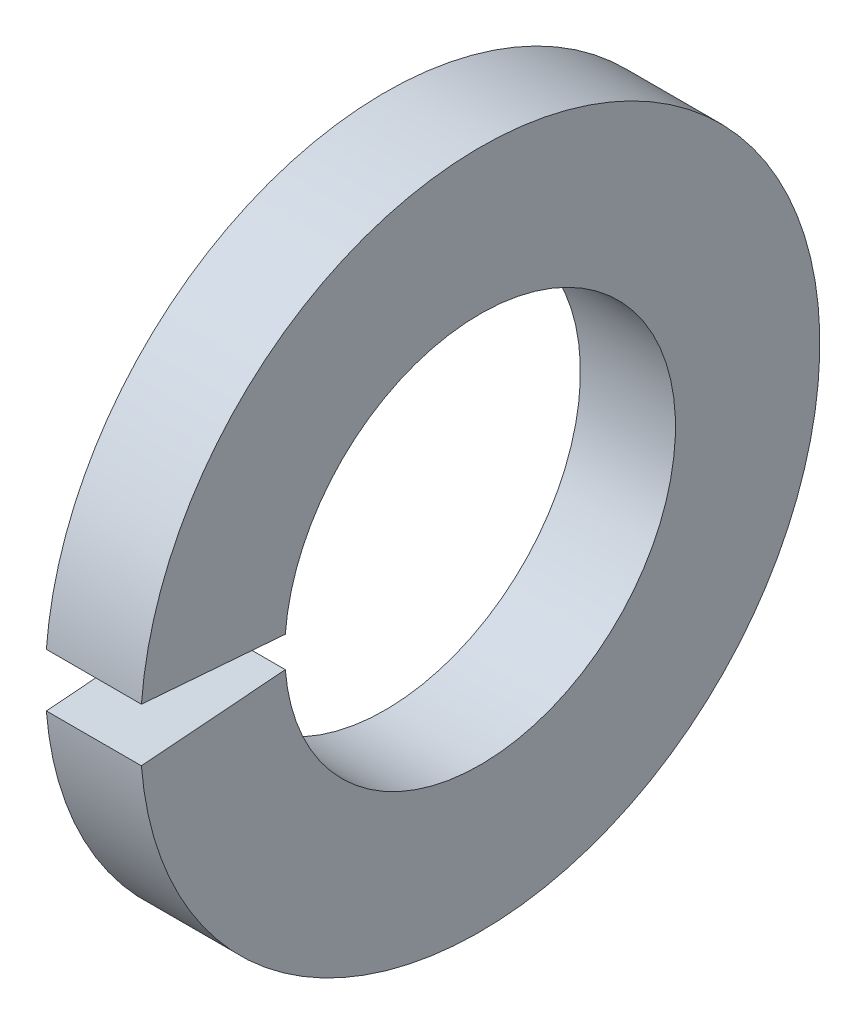
ISO-10303-21;
HEADER;
FILE_DESCRIPTION(('STEP AP214'),'2;1');
FILE_NAME('part.step','',(''),(''),'','','');
FILE_SCHEMA(('AUTOMOTIVE_DESIGN { 1 0 10303 214 1 1 1 1 }'));
ENDSEC;
DATA;
#1=APPLICATION_CONTEXT('core data for automotive mechanical design processes');
#2=APPLICATION_PROTOCOL_DEFINITION('international standard','automotive_design',2000,#1);
#3=PRODUCT_CONTEXT('',#1,'mechanical');
#4=PRODUCT('Part','Part','',(#3));
#5=PRODUCT_RELATED_PRODUCT_CATEGORY('part','',(#4));
#6=PRODUCT_DEFINITION_FORMATION('','',#4);
#7=PRODUCT_DEFINITION_CONTEXT('part definition',#1,'design');
#8=PRODUCT_DEFINITION('design','',#6,#7);
#9=PRODUCT_DEFINITION_SHAPE('','',#8);
#10=(LENGTH_UNIT() NAMED_UNIT(*) SI_UNIT(.MILLI.,.METRE.));
#11=(NAMED_UNIT(*) PLANE_ANGLE_UNIT() SI_UNIT($,.RADIAN.));
#12=(NAMED_UNIT(*) SI_UNIT($,.STERADIAN.) SOLID_ANGLE_UNIT());
#13=UNCERTAINTY_MEASURE_WITH_UNIT(LENGTH_MEASURE(1.E-05),#10,'distance_accuracy_value','');
#14=(GEOMETRIC_REPRESENTATION_CONTEXT(3) GLOBAL_UNCERTAINTY_ASSIGNED_CONTEXT((#13)) GLOBAL_UNIT_ASSIGNED_CONTEXT((#10,
#11,#12)) REPRESENTATION_CONTEXT('',''));
#15=CARTESIAN_POINT('',(0.,0.,0.));
#16=DIRECTION('',(0.,0.,1.));
#17=DIRECTION('',(1.,0.,0.));
#18=AXIS2_PLACEMENT_3D('',#15,#16,#17);
#19=CARTESIAN_POINT('',(-34.9249999999999,0.,0.));
#20=DIRECTION('',(-1.,0.,0.));
#21=DIRECTION('',(0.,0.,1.));
#22=AXIS2_PLACEMENT_3D('',#19,#20,#21);
#23=CYLINDRICAL_SURFACE('',#22,5.6896);
#24=CARTESIAN_POINT('',(0.,0.,0.));
#25=DIRECTION('',(-1.,0.,0.));
#26=DIRECTION('',(0.,0.,1.));
#27=AXIS2_PLACEMENT_3D('',#24,#25,#26);
#28=CIRCLE('',#27,5.6896);
#29=CARTESIAN_POINT('',(0.,0.446400871053151,5.67206086200801));
#30=VERTEX_POINT('',#29);
#31=CARTESIAN_POINT('',(0.,-0.446400871053151,5.67206086200801));
#32=VERTEX_POINT('',#31);
#33=EDGE_CURVE('E98',#30,#32,#28,.T.);
#34=ORIENTED_EDGE('',*,*,#33,.F.);
#35=DIRECTION('',(-1.,0.,0.));
#36=VECTOR('',#35,1.);
#37=CARTESIAN_POINT('',(-34.9249999999999,0.446400871053151,5.67206086200801));
#38=LINE('',#37,#36);
#39=CARTESIAN_POINT('',(-2.7686,0.446400871053151,5.67206086200801));
#40=VERTEX_POINT('',#39);
#41=EDGE_CURVE('E112',#30,#40,#38,.T.);
#42=ORIENTED_EDGE('',*,*,#41,.T.);
#43=CARTESIAN_POINT('',(-2.7686,0.,0.));
#44=DIRECTION('',(-1.,0.,0.));
#45=DIRECTION('',(0.,0.,1.));
#46=AXIS2_PLACEMENT_3D('',#43,#44,#45);
#47=CIRCLE('',#46,5.6896);
#48=CARTESIAN_POINT('',(-2.7686,-0.446400871053149,5.672060862008));
#49=VERTEX_POINT('',#48);
#50=EDGE_CURVE('E100',#40,#49,#47,.T.);
#51=ORIENTED_EDGE('',*,*,#50,.T.);
#52=DIRECTION('',(-1.,0.,0.));
#53=VECTOR('',#52,1.);
#54=CARTESIAN_POINT('',(-34.9249999999999,-0.446400871053151,5.67206086200801));
#55=LINE('',#54,#53);
#56=EDGE_CURVE('E68',#32,#49,#55,.T.);
#57=ORIENTED_EDGE('',*,*,#56,.F.);
#58=EDGE_LOOP('',(#34,#42,#51,#57));
#59=FACE_BOUND('',#58,.T.);
#60=ADVANCED_FACE('F47',(#59),#23,.F.);
#61=CARTESIAN_POINT('',(0.,5.6896,0.));
#62=DIRECTION('',(-1.,0.,0.));
#63=DIRECTION('',(0.,0.,1.));
#64=AXIS2_PLACEMENT_3D('',#61,#62,#63);
#65=PLANE('',#64);
#66=CARTESIAN_POINT('',(0.,0.,0.));
#67=DIRECTION('',(-1.,0.,0.));
#68=DIRECTION('',(0.,0.,1.));
#69=AXIS2_PLACEMENT_3D('',#66,#67,#68);
#70=CIRCLE('',#69,9.8933);
#71=CARTESIAN_POINT('',(0.,0.776219371764295,9.86280225782195));
#72=VERTEX_POINT('',#71);
#73=CARTESIAN_POINT('',(0.,-0.776219371764295,9.86280225782195));
#74=VERTEX_POINT('',#73);
#75=EDGE_CURVE('E104',#72,#74,#70,.T.);
#76=ORIENTED_EDGE('',*,*,#75,.F.);
#77=DIRECTION('',(0.,0.0784590957278456,0.996917333733128));
#78=VECTOR('',#77,1.);
#79=CARTESIAN_POINT('',(0.,0.,0.));
#80=LINE('',#79,#78);
#81=EDGE_CURVE('E92',#30,#72,#80,.T.);
#82=ORIENTED_EDGE('',*,*,#81,.F.);
#83=ORIENTED_EDGE('',*,*,#33,.T.);
#84=DIRECTION('',(0.,-0.0784590957278456,0.996917333733128));
#85=VECTOR('',#84,1.);
#86=CARTESIAN_POINT('',(0.,0.,0.));
#87=LINE('',#86,#85);
#88=EDGE_CURVE('E84',#32,#74,#87,.T.);
#89=ORIENTED_EDGE('',*,*,#88,.T.);
#90=EDGE_LOOP('',(#76,#82,#83,#89));
#91=FACE_BOUND('',#90,.T.);
#92=ADVANCED_FACE('F103',(#91),#65,.F.);
#93=CARTESIAN_POINT('',(-34.9249999999999,0.,0.));
#94=DIRECTION('',(-1.,0.,0.));
#95=DIRECTION('',(0.,0.,1.));
#96=AXIS2_PLACEMENT_3D('',#93,#94,#95);
#97=CYLINDRICAL_SURFACE('',#96,9.8933);
#98=CARTESIAN_POINT('',(-2.7686,0.,0.));
#99=DIRECTION('',(-1.,0.,0.));
#100=DIRECTION('',(0.,0.,1.));
#101=AXIS2_PLACEMENT_3D('',#98,#99,#100);
#102=CIRCLE('',#101,9.8933);
#103=CARTESIAN_POINT('',(-2.7686,0.776219371764296,9.86280225782195));
#104=VERTEX_POINT('',#103);
#105=CARTESIAN_POINT('',(-2.7686,-0.776219371764295,9.86280225782195));
#106=VERTEX_POINT('',#105);
#107=EDGE_CURVE('E106',#104,#106,#102,.T.);
#108=ORIENTED_EDGE('',*,*,#107,.F.);
#109=DIRECTION('',(-1.,0.,0.));
#110=VECTOR('',#109,1.);
#111=CARTESIAN_POINT('',(-34.9249999999999,0.776219371764295,9.86280225782196));
#112=LINE('',#111,#110);
#113=EDGE_CURVE('E61',#104,#72,#112,.F.);
#114=ORIENTED_EDGE('',*,*,#113,.T.);
#115=ORIENTED_EDGE('',*,*,#75,.T.);
#116=DIRECTION('',(-1.,0.,0.));
#117=VECTOR('',#116,1.);
#118=CARTESIAN_POINT('',(-34.9249999999999,-0.776219371764295,9.86280225782196));
#119=LINE('',#118,#117);
#120=EDGE_CURVE('E87',#106,#74,#119,.F.);
#121=ORIENTED_EDGE('',*,*,#120,.F.);
#122=EDGE_LOOP('',(#108,#114,#115,#121));
#123=FACE_BOUND('',#122,.T.);
#124=ADVANCED_FACE('F119',(#123),#97,.T.);
#125=CARTESIAN_POINT('',(-2.7686,9.8933,0.));
#126=DIRECTION('',(1.,0.,0.));
#127=DIRECTION('',(0.,0.,-1.));
#128=AXIS2_PLACEMENT_3D('',#125,#126,#127);
#129=PLANE('',#128);
#130=ORIENTED_EDGE('',*,*,#50,.F.);
#131=DIRECTION('',(0.,0.0784590957278456,0.996917333733128));
#132=VECTOR('',#131,1.);
#133=CARTESIAN_POINT('',(-2.7686,0.0609014699950641,0.773826546491265));
#134=LINE('',#133,#132);
#135=EDGE_CURVE('E13',#40,#104,#134,.T.);
#136=ORIENTED_EDGE('',*,*,#135,.T.);
#137=ORIENTED_EDGE('',*,*,#107,.T.);
#138=DIRECTION('',(0.,-0.0784590957278456,0.996917333733128));
#139=VECTOR('',#138,1.);
#140=CARTESIAN_POINT('',(-2.7686,0.0609014699950641,-0.773826546491265));
#141=LINE('',#140,#139);
#142=EDGE_CURVE('E54',#49,#106,#141,.T.);
#143=ORIENTED_EDGE('',*,*,#142,.F.);
#144=EDGE_LOOP('',(#130,#136,#137,#143));
#145=FACE_BOUND('',#144,.T.);
#146=ADVANCED_FACE('F121',(#145),#129,.F.);
#147=CARTESIAN_POINT('',(-2.7686,0.,0.));
#148=DIRECTION('',(0.,0.996917333733128,0.0784590957278456));
#149=DIRECTION('',(0.,-0.0784590957278456,0.996917333733128));
#150=AXIS2_PLACEMENT_3D('',#147,#148,#149);
#151=PLANE('',#150);
#152=ORIENTED_EDGE('',*,*,#56,.T.);
#153=ORIENTED_EDGE('',*,*,#142,.T.);
#154=ORIENTED_EDGE('',*,*,#120,.T.);
#155=ORIENTED_EDGE('',*,*,#88,.F.);
#156=EDGE_LOOP('',(#152,#153,#154,#155));
#157=FACE_BOUND('',#156,.T.);
#158=ADVANCED_FACE('F85',(#157),#151,.T.);
#159=CARTESIAN_POINT('',(-2.7686,0.,0.));
#160=DIRECTION('',(0.,0.996917333733128,-0.0784590957278456));
#161=DIRECTION('',(0.,0.0784590957278456,0.996917333733128));
#162=AXIS2_PLACEMENT_3D('',#159,#160,#161);
#163=PLANE('',#162);
#164=ORIENTED_EDGE('',*,*,#81,.T.);
#165=ORIENTED_EDGE('',*,*,#113,.F.);
#166=ORIENTED_EDGE('',*,*,#135,.F.);
#167=ORIENTED_EDGE('',*,*,#41,.F.);
#168=EDGE_LOOP('',(#164,#165,#166,#167));
#169=FACE_BOUND('',#168,.T.);
#170=ADVANCED_FACE('F116',(#169),#163,.F.);
#171=CLOSED_SHELL('',(#60,#92,#124,#146,#158,#170));
#172=MANIFOLD_SOLID_BREP('B2',#171);
#173=ADVANCED_BREP_SHAPE_REPRESENTATION('',(#18,#172),#14);
#174=SHAPE_DEFINITION_REPRESENTATION(#9,#173);
ENDSEC;
END-ISO-10303-21;
